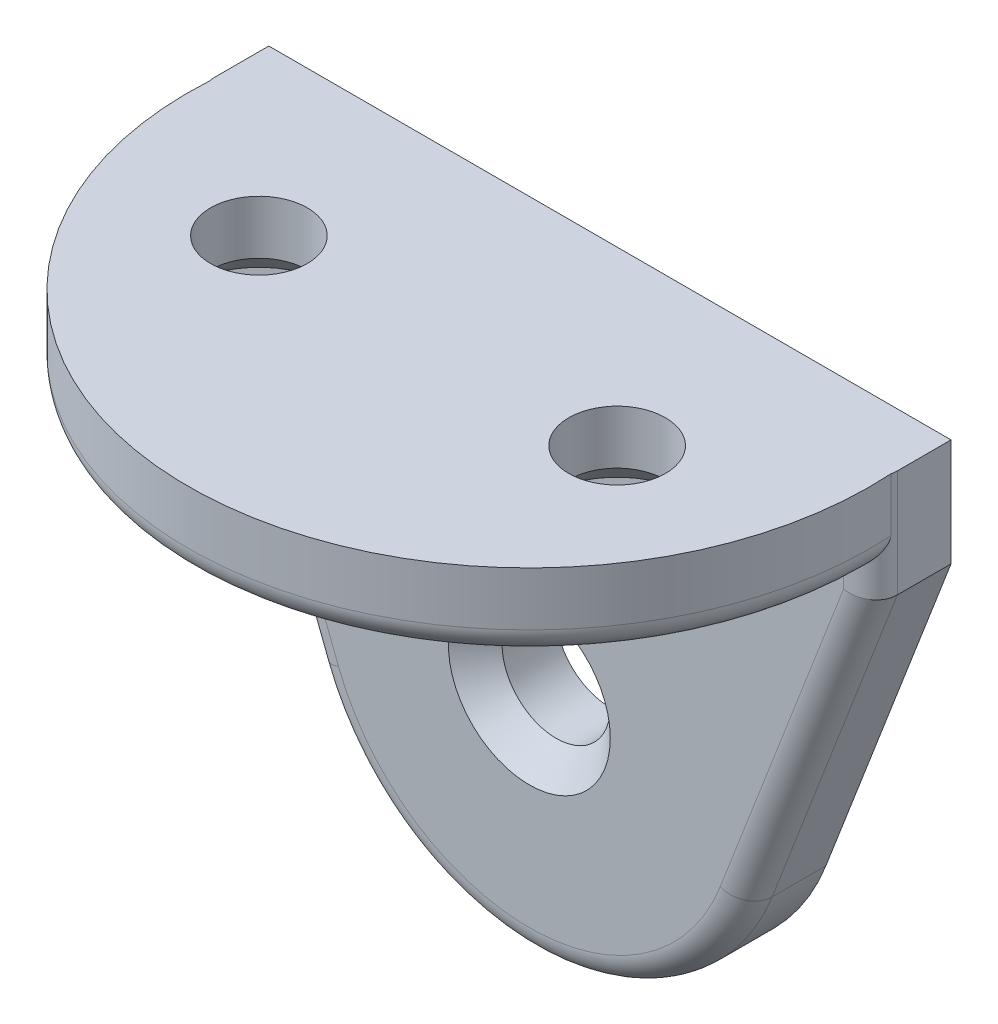
ISO-10303-21;
HEADER;
FILE_DESCRIPTION(('STEP AP214'),'2;1');
FILE_NAME('part.step','',(''),(''),'','','');
FILE_SCHEMA(('AUTOMOTIVE_DESIGN { 1 0 10303 214 1 1 1 1 }'));
ENDSEC;
DATA;
#1=APPLICATION_CONTEXT('core data for automotive mechanical design processes');
#2=APPLICATION_PROTOCOL_DEFINITION('international standard','automotive_design',2000,#1);
#3=PRODUCT_CONTEXT('',#1,'mechanical');
#4=PRODUCT('Part','Part','',(#3));
#5=PRODUCT_RELATED_PRODUCT_CATEGORY('part','',(#4));
#6=PRODUCT_DEFINITION_FORMATION('','',#4);
#7=PRODUCT_DEFINITION_CONTEXT('part definition',#1,'design');
#8=PRODUCT_DEFINITION('design','',#6,#7);
#9=PRODUCT_DEFINITION_SHAPE('','',#8);
#10=(LENGTH_UNIT() NAMED_UNIT(*) SI_UNIT(.MILLI.,.METRE.));
#11=(NAMED_UNIT(*) PLANE_ANGLE_UNIT() SI_UNIT($,.RADIAN.));
#12=(NAMED_UNIT(*) SI_UNIT($,.STERADIAN.) SOLID_ANGLE_UNIT());
#13=UNCERTAINTY_MEASURE_WITH_UNIT(LENGTH_MEASURE(1.E-05),#10,'distance_accuracy_value','');
#14=(GEOMETRIC_REPRESENTATION_CONTEXT(3) GLOBAL_UNCERTAINTY_ASSIGNED_CONTEXT((#13)) GLOBAL_UNIT_ASSIGNED_CONTEXT((#10,
#11,#12)) REPRESENTATION_CONTEXT('',''));
#15=CARTESIAN_POINT('',(0.,0.,0.));
#16=DIRECTION('',(0.,0.,1.));
#17=DIRECTION('',(1.,0.,0.));
#18=AXIS2_PLACEMENT_3D('',#15,#16,#17);
#19=CARTESIAN_POINT('',(9.80421891414499E-06,336.28568414226,3.));
#20=DIRECTION('',(0.,0.,1.));
#21=DIRECTION('',(1.,0.,0.));
#22=AXIS2_PLACEMENT_3D('',#19,#20,#21);
#23=PLANE('',#22);
#24=DIRECTION('',(1.,0.,0.));
#25=VECTOR('',#24,1.);
#26=CARTESIAN_POINT('',(-12.7,346.247211517188,3.00000000000001));
#27=LINE('',#26,#25);
#28=CARTESIAN_POINT('',(-11.7000000000015,346.247211517188,3.00000000000001));
#29=VERTEX_POINT('',#28);
#30=CARTESIAN_POINT('',(11.6999999999991,346.247211517188,3.00000000000001));
#31=VERTEX_POINT('',#30);
#32=EDGE_CURVE('E170',#29,#31,#27,.T.);
#33=ORIENTED_EDGE('',*,*,#32,.F.);
#34=DIRECTION('',(0.,-1.,0.));
#35=VECTOR('',#34,1.);
#36=CARTESIAN_POINT('',(-11.7,345.247211517184,3.));
#37=LINE('',#36,#35);
#38=CARTESIAN_POINT('',(-11.7,345.433623759028,3.));
#39=VERTEX_POINT('',#38);
#40=EDGE_CURVE('E241',#29,#39,#37,.T.);
#41=ORIENTED_EDGE('',*,*,#40,.T.);
#42=DIRECTION('',(0.3603040881604,-0.932834907180742,0.));
#43=VECTOR('',#42,1.);
#44=CARTESIAN_POINT('',(-7.10645479987016,333.540838050512,3.));
#45=LINE('',#44,#43);
#46=CARTESIAN_POINT('',(-7.10645479987004,333.540838050512,3.));
#47=VERTEX_POINT('',#46);
#48=EDGE_CURVE('E235',#39,#47,#45,.T.);
#49=ORIENTED_EDGE('',*,*,#48,.T.);
#50=CARTESIAN_POINT('',(9.80421891414499E-06,336.28568414226,3.));
#51=DIRECTION('',(0.,0.,1.));
#52=DIRECTION('',(1.,0.,0.));
#53=AXIS2_PLACEMENT_3D('',#50,#51,#52);
#54=CIRCLE('',#53,7.61813751756628);
#55=CARTESIAN_POINT('',(7.10647828965528,333.540848099424,3.));
#56=VERTEX_POINT('',#55);
#57=EDGE_CURVE('E229',#47,#56,#54,.T.);
#58=ORIENTED_EDGE('',*,*,#57,.T.);
#59=DIRECTION('',(0.360302769083212,0.932835416668434,0.));
#60=VECTOR('',#59,1.);
#61=CARTESIAN_POINT('',(11.7671645833316,345.607514286268,3.));
#62=LINE('',#61,#60);
#63=CARTESIAN_POINT('',(11.7,345.433623027433,3.));
#64=VERTEX_POINT('',#63);
#65=EDGE_CURVE('E232',#56,#64,#62,.T.);
#66=ORIENTED_EDGE('',*,*,#65,.T.);
#67=DIRECTION('',(1.6913553890772E-13,1.,0.));
#68=VECTOR('',#67,1.);
#69=CARTESIAN_POINT('',(11.7000000000003,347.247211517188,3.));
#70=LINE('',#69,#68);
#71=EDGE_CURVE('E238',#64,#31,#70,.T.);
#72=ORIENTED_EDGE('',*,*,#71,.T.);
#73=EDGE_LOOP('',(#33,#41,#49,#58,#66,#72));
#74=FACE_BOUND('',#73,.T.);
#75=CARTESIAN_POINT('',(9.80421891414499E-06,336.28568414226,3.));
#76=DIRECTION('',(0.,0.,1.));
#77=DIRECTION('',(1.,0.,0.));
#78=AXIS2_PLACEMENT_3D('',#75,#76,#77);
#79=CIRCLE('',#78,3.013761755858);
#80=CARTESIAN_POINT('',(3.01377156007692,336.28568414226,3.));
#81=VERTEX_POINT('',#80);
#82=EDGE_CURVE('E203',#81,#81,#79,.F.);
#83=ORIENTED_EDGE('',*,*,#82,.T.);
#84=EDGE_LOOP('',(#83));
#85=FACE_BOUND('',#84,.T.);
#86=ADVANCED_FACE('F49',(#74,#85),#23,.T.);
#87=CARTESIAN_POINT('',(9.80421891414499E-06,336.28568414226,0.));
#88=DIRECTION('',(0.,0.,1.));
#89=DIRECTION('',(1.,0.,0.));
#90=AXIS2_PLACEMENT_3D('',#87,#88,#89);
#91=PLANE('',#90);
#92=DIRECTION('',(1.6913553890772E-13,1.,0.));
#93=VECTOR('',#92,1.);
#94=CARTESIAN_POINT('',(12.7000000000007,349.247211517185,0.));
#95=LINE('',#94,#93);
#96=CARTESIAN_POINT('',(12.7,345.247211517184,0.));
#97=VERTEX_POINT('',#96);
#98=CARTESIAN_POINT('',(12.7000000000007,349.247211517185,0.));
#99=VERTEX_POINT('',#98);
#100=EDGE_CURVE('E155',#97,#99,#95,.T.);
#101=ORIENTED_EDGE('',*,*,#100,.F.);
#102=DIRECTION('',(0.360302769083212,0.932835416668434,0.));
#103=VECTOR('',#102,1.);
#104=CARTESIAN_POINT('',(12.7,345.247211517184,0.));
#105=LINE('',#104,#103);
#106=CARTESIAN_POINT('',(8.03931370632371,333.180545330341,0.));
#107=VERTEX_POINT('',#106);
#108=EDGE_CURVE('E184',#107,#97,#105,.T.);
#109=ORIENTED_EDGE('',*,*,#108,.F.);
#110=CARTESIAN_POINT('',(9.80421891414499E-06,336.28568414226,0.));
#111=DIRECTION('',(0.,0.,1.));
#112=DIRECTION('',(1.,0.,0.));
#113=AXIS2_PLACEMENT_3D('',#110,#111,#112);
#114=CIRCLE('',#113,8.61813751756628);
#115=CARTESIAN_POINT('',(-8.03928970705091,333.180533962352,0.));
#116=VERTEX_POINT('',#115);
#117=EDGE_CURVE('E180',#116,#107,#114,.T.);
#118=ORIENTED_EDGE('',*,*,#117,.F.);
#119=DIRECTION('',(0.3603040881604,-0.932834907180742,0.));
#120=VECTOR('',#119,1.);
#121=CARTESIAN_POINT('',(-12.7,345.247211517184,0.));
#122=LINE('',#121,#120);
#123=CARTESIAN_POINT('',(-12.7,345.247211517184,0.));
#124=VERTEX_POINT('',#123);
#125=EDGE_CURVE('E176',#124,#116,#122,.T.);
#126=ORIENTED_EDGE('',*,*,#125,.F.);
#127=DIRECTION('',(0.,-1.,0.));
#128=VECTOR('',#127,1.);
#129=CARTESIAN_POINT('',(-12.7,349.247211517185,0.));
#130=LINE('',#129,#128);
#131=CARTESIAN_POINT('',(-12.7,349.247211517185,0.));
#132=VERTEX_POINT('',#131);
#133=EDGE_CURVE('E158',#132,#124,#130,.T.);
#134=ORIENTED_EDGE('',*,*,#133,.F.);
#135=DIRECTION('',(-1.,0.,0.));
#136=VECTOR('',#135,1.);
#137=CARTESIAN_POINT('',(12.7000000000007,349.247211517185,0.));
#138=LINE('',#137,#136);
#139=EDGE_CURVE('E139',#99,#132,#138,.T.);
#140=ORIENTED_EDGE('',*,*,#139,.F.);
#141=EDGE_LOOP('',(#101,#109,#118,#126,#134,#140));
#142=FACE_BOUND('',#141,.T.);
#143=CARTESIAN_POINT('',(9.80421891414499E-06,336.28568414226,0.));
#144=DIRECTION('',(0.,0.,1.));
#145=DIRECTION('',(1.,0.,0.));
#146=AXIS2_PLACEMENT_3D('',#143,#144,#145);
#147=CIRCLE('',#146,2.01376175585801);
#148=CARTESIAN_POINT('',(2.01377156007693,336.28568414226,0.));
#149=VERTEX_POINT('',#148);
#150=EDGE_CURVE('E166',#149,#149,#147,.T.);
#151=ORIENTED_EDGE('',*,*,#150,.T.);
#152=EDGE_LOOP('',(#151));
#153=FACE_BOUND('',#152,.T.);
#154=ADVANCED_FACE('F152',(#142,#153),#91,.F.);
#155=CARTESIAN_POINT('',(12.7000000000007,349.247211517185,3.));
#156=DIRECTION('',(-1.,1.6913553890772E-13,0.));
#157=DIRECTION('',(-1.6913553890772E-13,-1.,0.));
#158=AXIS2_PLACEMENT_3D('',#155,#156,#157);
#159=PLANE('',#158);
#160=DIRECTION('',(0.,0.,-1.));
#161=VECTOR('',#160,1.);
#162=CARTESIAN_POINT('',(12.7000000000007,349.247211517185,3.));
#163=LINE('',#162,#161);
#164=CARTESIAN_POINT('',(12.7000000000007,349.247211517185,2.));
#165=VERTEX_POINT('',#164);
#166=EDGE_CURVE('E133',#165,#99,#163,.T.);
#167=ORIENTED_EDGE('',*,*,#166,.F.);
#168=DIRECTION('',(1.6913553890772E-13,1.,0.));
#169=VECTOR('',#168,1.);
#170=CARTESIAN_POINT('',(12.7,345.247211517184,2.));
#171=LINE('',#170,#169);
#172=CARTESIAN_POINT('',(12.7,345.247211517184,2.));
#173=VERTEX_POINT('',#172);
#174=EDGE_CURVE('E253',#165,#173,#171,.F.);
#175=ORIENTED_EDGE('',*,*,#174,.T.);
#176=DIRECTION('',(0.,0.,-1.));
#177=VECTOR('',#176,1.);
#178=CARTESIAN_POINT('',(12.7,345.247211517184,3.));
#179=LINE('',#178,#177);
#180=EDGE_CURVE('E163',#173,#97,#179,.T.);
#181=ORIENTED_EDGE('',*,*,#180,.T.);
#182=ORIENTED_EDGE('',*,*,#100,.T.);
#183=EDGE_LOOP('',(#167,#175,#181,#182));
#184=FACE_BOUND('',#183,.T.);
#185=ADVANCED_FACE('F161',(#184),#159,.F.);
#186=CARTESIAN_POINT('',(12.7000000000007,349.247211517185,3.));
#187=DIRECTION('',(0.,-1.,0.));
#188=DIRECTION('',(1.,0.,0.));
#189=AXIS2_PLACEMENT_3D('',#186,#187,#188);
#190=PLANE('',#189);
#191=CARTESIAN_POINT('',(-11.7,349.247211517185,2.));
#192=DIRECTION('',(0.,-1.,0.));
#193=DIRECTION('',(1.,0.,0.));
#194=AXIS2_PLACEMENT_3D('',#191,#192,#193);
#195=CIRCLE('',#194,1.);
#196=CARTESIAN_POINT('',(-12.7,349.247211517185,2.));
#197=VERTEX_POINT('',#196);
#198=CARTESIAN_POINT('',(-12.675911637922,349.247211517185,2.21816616366818));
#199=VERTEX_POINT('',#198);
#200=EDGE_CURVE('E250',#197,#199,#195,.F.);
#201=ORIENTED_EDGE('',*,*,#200,.T.);
#202=CARTESIAN_POINT('',(-1.21939012165526E-12,349.247211517188,3.));
#203=DIRECTION('',(0.,-1.,0.));
#204=DIRECTION('',(0.,0.,-1.));
#205=AXIS2_PLACEMENT_3D('',#202,#203,#204);
#206=CIRCLE('',#205,12.7000000000003);
#207=CARTESIAN_POINT('',(12.6759116379203,349.247211517185,2.21816616367908));
#208=VERTEX_POINT('',#207);
#209=EDGE_CURVE('E367',#208,#199,#206,.T.);
#210=ORIENTED_EDGE('',*,*,#209,.F.);
#211=CARTESIAN_POINT('',(11.7000000000007,349.247211517185,2.));
#212=DIRECTION('',(0.,-1.,0.));
#213=DIRECTION('',(1.,0.,0.));
#214=AXIS2_PLACEMENT_3D('',#211,#212,#213);
#215=CIRCLE('',#214,1.);
#216=EDGE_CURVE('E142',#208,#165,#215,.F.);
#217=ORIENTED_EDGE('',*,*,#216,.T.);
#218=ORIENTED_EDGE('',*,*,#166,.T.);
#219=ORIENTED_EDGE('',*,*,#139,.T.);
#220=DIRECTION('',(0.,0.,-1.));
#221=VECTOR('',#220,1.);
#222=CARTESIAN_POINT('',(-12.7,349.247211517185,3.));
#223=LINE('',#222,#221);
#224=EDGE_CURVE('E148',#197,#132,#223,.T.);
#225=ORIENTED_EDGE('',*,*,#224,.F.);
#226=EDGE_LOOP('',(#201,#210,#217,#218,#219,#225));
#227=FACE_BOUND('',#226,.T.);
#228=CARTESIAN_POINT('',(-6.76844476050707,349.247211517188,6.2999999999915));
#229=DIRECTION('',(0.,-1.,0.));
#230=DIRECTION('',(0.,0.,-1.));
#231=AXIS2_PLACEMENT_3D('',#228,#229,#230);
#232=CIRCLE('',#231,1.8);
#233=CARTESIAN_POINT('',(-6.76844476050707,349.247211517188,4.4999999999915));
#234=VERTEX_POINT('',#233);
#235=EDGE_CURVE('E362',#234,#234,#232,.T.);
#236=ORIENTED_EDGE('',*,*,#235,.T.);
#237=EDGE_LOOP('',(#236));
#238=FACE_BOUND('',#237,.T.);
#239=CARTESIAN_POINT('',(6.66844476050722,349.247211517188,6.40000000000055));
#240=DIRECTION('',(0.,-1.,0.));
#241=DIRECTION('',(0.,0.,-1.));
#242=AXIS2_PLACEMENT_3D('',#239,#240,#241);
#243=CIRCLE('',#242,1.8);
#244=CARTESIAN_POINT('',(6.66844476050722,349.247211517188,4.60000000000055));
#245=VERTEX_POINT('',#244);
#246=EDGE_CURVE('E359',#245,#245,#243,.T.);
#247=ORIENTED_EDGE('',*,*,#246,.T.);
#248=EDGE_LOOP('',(#247));
#249=FACE_BOUND('',#248,.T.);
#250=ADVANCED_FACE('F136',(#227,#238,#249),#190,.F.);
#251=CARTESIAN_POINT('',(-12.7,349.247211517185,3.));
#252=DIRECTION('',(1.,0.,0.));
#253=DIRECTION('',(0.,0.,-1.));
#254=AXIS2_PLACEMENT_3D('',#251,#252,#253);
#255=PLANE('',#254);
#256=DIRECTION('',(0.,0.,-1.));
#257=VECTOR('',#256,1.);
#258=CARTESIAN_POINT('',(-12.7,345.247211517184,3.));
#259=LINE('',#258,#257);
#260=CARTESIAN_POINT('',(-12.7,345.247211517184,2.));
#261=VERTEX_POINT('',#260);
#262=EDGE_CURVE('E195',#261,#124,#259,.T.);
#263=ORIENTED_EDGE('',*,*,#262,.F.);
#264=DIRECTION('',(0.,-1.,0.));
#265=VECTOR('',#264,1.);
#266=CARTESIAN_POINT('',(-12.7,347.247211517188,2.));
#267=LINE('',#266,#265);
#268=EDGE_CURVE('E245',#261,#197,#267,.F.);
#269=ORIENTED_EDGE('',*,*,#268,.T.);
#270=ORIENTED_EDGE('',*,*,#224,.T.);
#271=ORIENTED_EDGE('',*,*,#133,.T.);
#272=EDGE_LOOP('',(#263,#269,#270,#271));
#273=FACE_BOUND('',#272,.T.);
#274=ADVANCED_FACE('F315',(#273),#255,.F.);
#275=CARTESIAN_POINT('',(-12.7,345.247211517184,3.));
#276=DIRECTION('',(0.932834907180742,0.360304088160399,0.));
#277=DIRECTION('',(-0.3603040881604,0.932834907180742,0.));
#278=AXIS2_PLACEMENT_3D('',#275,#276,#277);
#279=PLANE('',#278);
#280=DIRECTION('',(0.,0.,-1.));
#281=VECTOR('',#280,1.);
#282=CARTESIAN_POINT('',(-8.03928970705091,333.180533962352,3.));
#283=LINE('',#282,#281);
#284=CARTESIAN_POINT('',(-8.03928970705091,333.180533962352,2.));
#285=VERTEX_POINT('',#284);
#286=EDGE_CURVE('E192',#285,#116,#283,.T.);
#287=ORIENTED_EDGE('',*,*,#286,.F.);
#288=DIRECTION('',(0.3603040881604,-0.932834907180742,0.));
#289=VECTOR('',#288,1.);
#290=CARTESIAN_POINT('',(-12.7,345.247211517184,2.));
#291=LINE('',#290,#289);
#292=EDGE_CURVE('E256',#285,#261,#291,.F.);
#293=ORIENTED_EDGE('',*,*,#292,.T.);
#294=ORIENTED_EDGE('',*,*,#262,.T.);
#295=ORIENTED_EDGE('',*,*,#125,.T.);
#296=EDGE_LOOP('',(#287,#293,#294,#295));
#297=FACE_BOUND('',#296,.T.);
#298=ADVANCED_FACE('F318',(#297),#279,.F.);
#299=CARTESIAN_POINT('',(9.80421891414499E-06,336.28568414226,3.));
#300=DIRECTION('',(0.,0.,-1.));
#301=DIRECTION('',(-1.,0.,0.));
#302=AXIS2_PLACEMENT_3D('',#299,#300,#301);
#303=CYLINDRICAL_SURFACE('',#302,8.61813751756628);
#304=DIRECTION('',(0.,0.,-1.));
#305=VECTOR('',#304,1.);
#306=CARTESIAN_POINT('',(8.03931370632371,333.180545330341,3.));
#307=LINE('',#306,#305);
#308=CARTESIAN_POINT('',(8.03931370632371,333.180545330341,2.));
#309=VERTEX_POINT('',#308);
#310=EDGE_CURVE('E189',#309,#107,#307,.T.);
#311=ORIENTED_EDGE('',*,*,#310,.F.);
#312=CARTESIAN_POINT('',(9.80421891414499E-06,336.28568414226,2.));
#313=DIRECTION('',(0.,0.,1.));
#314=DIRECTION('',(1.,0.,0.));
#315=AXIS2_PLACEMENT_3D('',#312,#313,#314);
#316=CIRCLE('',#315,8.61813751756628);
#317=EDGE_CURVE('E262',#309,#285,#316,.F.);
#318=ORIENTED_EDGE('',*,*,#317,.T.);
#319=ORIENTED_EDGE('',*,*,#286,.T.);
#320=ORIENTED_EDGE('',*,*,#117,.T.);
#321=EDGE_LOOP('',(#311,#318,#319,#320));
#322=FACE_BOUND('',#321,.T.);
#323=ADVANCED_FACE('F322',(#322),#303,.T.);
#324=CARTESIAN_POINT('',(12.7,345.247211517184,3.));
#325=DIRECTION('',(-0.932835416668433,0.360302769083212,0.));
#326=DIRECTION('',(-0.360302769083212,-0.932835416668434,0.));
#327=AXIS2_PLACEMENT_3D('',#324,#325,#326);
#328=PLANE('',#327);
#329=ORIENTED_EDGE('',*,*,#180,.F.);
#330=DIRECTION('',(0.360302769083212,0.932835416668434,0.));
#331=VECTOR('',#330,1.);
#332=CARTESIAN_POINT('',(8.03931370632359,333.180545330341,2.));
#333=LINE('',#332,#331);
#334=EDGE_CURVE('E259',#173,#309,#333,.F.);
#335=ORIENTED_EDGE('',*,*,#334,.T.);
#336=ORIENTED_EDGE('',*,*,#310,.T.);
#337=ORIENTED_EDGE('',*,*,#108,.T.);
#338=EDGE_LOOP('',(#329,#335,#336,#337));
#339=FACE_BOUND('',#338,.T.);
#340=ADVANCED_FACE('F326',(#339),#328,.F.);
#341=CARTESIAN_POINT('',(9.80421891414499E-06,336.28568414226,3.));
#342=DIRECTION('',(0.,0.,-1.));
#343=DIRECTION('',(-1.,0.,0.));
#344=AXIS2_PLACEMENT_3D('',#341,#342,#343);
#345=CYLINDRICAL_SURFACE('',#344,2.01376175585801);
#346=CARTESIAN_POINT('',(9.80421891414499E-06,336.28568414226,2.00000000000001));
#347=DIRECTION('',(0.,0.,1.));
#348=DIRECTION('',(1.,0.,0.));
#349=AXIS2_PLACEMENT_3D('',#346,#347,#348);
#350=CIRCLE('',#349,2.01376175585801);
#351=CARTESIAN_POINT('',(2.01377156007693,336.28568414226,2.00000000000001));
#352=VERTEX_POINT('',#351);
#353=EDGE_CURVE('E147',#352,#352,#350,.T.);
#354=ORIENTED_EDGE('',*,*,#353,.T.);
#355=EDGE_LOOP('',(#354));
#356=FACE_BOUND('',#355,.T.);
#357=ORIENTED_EDGE('',*,*,#150,.F.);
#358=EDGE_LOOP('',(#357));
#359=FACE_BOUND('',#358,.T.);
#360=ADVANCED_FACE('F330',(#356,#359),#345,.F.);
#361=CARTESIAN_POINT('',(-1.20891567763873E-12,346.247211517188,3.00000000000001));
#362=DIRECTION('',(0.,-1.,0.));
#363=DIRECTION('',(0.,0.,-1.));
#364=AXIS2_PLACEMENT_3D('',#361,#362,#363);
#365=PLANE('',#364);
#366=CARTESIAN_POINT('',(6.66844476050723,346.247211517188,6.40000000000056));
#367=DIRECTION('',(0.,-1.,0.));
#368=DIRECTION('',(0.,0.,-1.));
#369=AXIS2_PLACEMENT_3D('',#366,#367,#368);
#370=CIRCLE('',#369,2.80000000000006);
#371=CARTESIAN_POINT('',(6.66844476050723,346.247211517188,3.6000000000005));
#372=VERTEX_POINT('',#371);
#373=EDGE_CURVE('E215',#372,#372,#370,.F.);
#374=ORIENTED_EDGE('',*,*,#373,.T.);
#375=EDGE_LOOP('',(#374));
#376=FACE_BOUND('',#375,.T.);
#377=CARTESIAN_POINT('',(-6.76844476050706,346.247211517188,6.29999999999151));
#378=DIRECTION('',(0.,-1.,0.));
#379=DIRECTION('',(0.,0.,-1.));
#380=AXIS2_PLACEMENT_3D('',#377,#378,#379);
#381=CIRCLE('',#380,2.80000000000003);
#382=CARTESIAN_POINT('',(-6.76844476050706,346.247211517188,3.49999999999148));
#383=VERTEX_POINT('',#382);
#384=EDGE_CURVE('E211',#383,#383,#381,.F.);
#385=ORIENTED_EDGE('',*,*,#384,.T.);
#386=EDGE_LOOP('',(#385));
#387=FACE_BOUND('',#386,.T.);
#388=ORIENTED_EDGE('',*,*,#32,.T.);
#389=CARTESIAN_POINT('',(-1.20891567763873E-12,346.247211517188,3.00000000000001));
#390=DIRECTION('',(0.,-1.,0.));
#391=DIRECTION('',(0.,0.,-1.));
#392=AXIS2_PLACEMENT_3D('',#389,#390,#391);
#393=CIRCLE('',#392,11.7000000000003);
#394=EDGE_CURVE('E223',#31,#29,#393,.T.);
#395=ORIENTED_EDGE('',*,*,#394,.T.);
#396=EDGE_LOOP('',(#388,#395));
#397=FACE_BOUND('',#396,.T.);
#398=ADVANCED_FACE('F339',(#376,#387,#397),#365,.T.);
#399=CARTESIAN_POINT('',(-1.20891567763873E-12,346.247211517188,3.00000000000001));
#400=DIRECTION('',(0.,1.,0.));
#401=DIRECTION('',(0.,0.,1.));
#402=AXIS2_PLACEMENT_3D('',#399,#400,#401);
#403=CYLINDRICAL_SURFACE('',#402,12.7000000000003);
#404=ORIENTED_EDGE('',*,*,#209,.T.);
#405=DIRECTION('',(0.,1.,0.));
#406=VECTOR('',#405,1.);
#407=CARTESIAN_POINT('',(-12.675911637922,349.247211517185,2.21816616366818));
#408=LINE('',#407,#406);
#409=CARTESIAN_POINT('',(-12.6759116379218,347.247211517188,2.21816616366594));
#410=VERTEX_POINT('',#409);
#411=EDGE_CURVE('E265',#199,#410,#408,.F.);
#412=ORIENTED_EDGE('',*,*,#411,.T.);
#413=CARTESIAN_POINT('',(-1.21240715897758E-12,347.247211517188,3.00000000000001));
#414=DIRECTION('',(0.,-1.,0.));
#415=DIRECTION('',(0.,0.,-1.));
#416=AXIS2_PLACEMENT_3D('',#413,#414,#415);
#417=CIRCLE('',#416,12.7000000000003);
#418=CARTESIAN_POINT('',(12.67591163792,347.247211517188,2.21816616367562));
#419=VERTEX_POINT('',#418);
#420=EDGE_CURVE('E67',#410,#419,#417,.F.);
#421=ORIENTED_EDGE('',*,*,#420,.T.);
#422=DIRECTION('',(-1.6913553890772E-13,-1.,0.));
#423=VECTOR('',#422,1.);
#424=CARTESIAN_POINT('',(12.67591163792,347.247211517188,2.21816616367562));
#425=LINE('',#424,#423);
#426=EDGE_CURVE('E11',#419,#208,#425,.F.);
#427=ORIENTED_EDGE('',*,*,#426,.T.);
#428=EDGE_LOOP('',(#404,#412,#421,#427));
#429=FACE_BOUND('',#428,.T.);
#430=ADVANCED_FACE('F341',(#429),#403,.T.);
#431=CARTESIAN_POINT('',(-6.76844476050706,346.247211517188,6.29999999999151));
#432=DIRECTION('',(0.,1.,0.));
#433=DIRECTION('',(0.,0.,1.));
#434=AXIS2_PLACEMENT_3D('',#431,#432,#433);
#435=CYLINDRICAL_SURFACE('',#434,1.8);
#436=CARTESIAN_POINT('',(-6.76844476050707,347.247211517188,6.29999999999151));
#437=DIRECTION('',(0.,-1.,0.));
#438=DIRECTION('',(0.,0.,-1.));
#439=AXIS2_PLACEMENT_3D('',#436,#437,#438);
#440=CIRCLE('',#439,1.8);
#441=CARTESIAN_POINT('',(-6.76844476050707,347.247211517188,4.4999999999915));
#442=VERTEX_POINT('',#441);
#443=EDGE_CURVE('E219',#442,#442,#440,.T.);
#444=ORIENTED_EDGE('',*,*,#443,.T.);
#445=EDGE_LOOP('',(#444));
#446=FACE_BOUND('',#445,.T.);
#447=ORIENTED_EDGE('',*,*,#235,.F.);
#448=EDGE_LOOP('',(#447));
#449=FACE_BOUND('',#448,.T.);
#450=ADVANCED_FACE('F344',(#446,#449),#435,.F.);
#451=CARTESIAN_POINT('',(6.66844476050723,346.247211517188,6.40000000000056));
#452=DIRECTION('',(0.,1.,0.));
#453=DIRECTION('',(0.,0.,1.));
#454=AXIS2_PLACEMENT_3D('',#451,#452,#453);
#455=CYLINDRICAL_SURFACE('',#454,1.8);
#456=CARTESIAN_POINT('',(6.66844476050723,347.247211517188,6.40000000000055));
#457=DIRECTION('',(0.,-1.,0.));
#458=DIRECTION('',(0.,0.,-1.));
#459=AXIS2_PLACEMENT_3D('',#456,#457,#458);
#460=CIRCLE('',#459,1.8);
#461=CARTESIAN_POINT('',(6.66844476050723,347.247211517188,4.60000000000055));
#462=VERTEX_POINT('',#461);
#463=EDGE_CURVE('E207',#462,#462,#460,.T.);
#464=ORIENTED_EDGE('',*,*,#463,.T.);
#465=EDGE_LOOP('',(#464));
#466=FACE_BOUND('',#465,.T.);
#467=ORIENTED_EDGE('',*,*,#246,.F.);
#468=EDGE_LOOP('',(#467));
#469=FACE_BOUND('',#468,.T.);
#470=ADVANCED_FACE('F309',(#466,#469),#455,.F.);
#471=CARTESIAN_POINT('',(9.80421891414499E-06,336.28568414226,2.00000000000001));
#472=DIRECTION('',(0.,0.,1.));
#473=DIRECTION('',(1.,0.,0.));
#474=AXIS2_PLACEMENT_3D('',#471,#472,#473);
#475=CONICAL_SURFACE('',#474,2.01376175585801,0.78539816339745);
#476=ORIENTED_EDGE('',*,*,#82,.F.);
#477=EDGE_LOOP('',(#476));
#478=FACE_BOUND('',#477,.T.);
#479=ORIENTED_EDGE('',*,*,#353,.F.);
#480=EDGE_LOOP('',(#479));
#481=FACE_BOUND('',#480,.T.);
#482=ADVANCED_FACE('F303',(#478,#481),#475,.F.);
#483=CARTESIAN_POINT('',(6.66844476050723,347.247211517188,6.40000000000055));
#484=DIRECTION('',(0.,-1.,0.));
#485=DIRECTION('',(0.,0.,-1.));
#486=AXIS2_PLACEMENT_3D('',#483,#484,#485);
#487=CONICAL_SURFACE('',#486,1.8,0.785398163397467);
#488=ORIENTED_EDGE('',*,*,#373,.F.);
#489=EDGE_LOOP('',(#488));
#490=FACE_BOUND('',#489,.T.);
#491=ORIENTED_EDGE('',*,*,#463,.F.);
#492=EDGE_LOOP('',(#491));
#493=FACE_BOUND('',#492,.T.);
#494=ADVANCED_FACE('F296',(#490,#493),#487,.F.);
#495=CARTESIAN_POINT('',(-6.76844476050707,347.247211517188,6.29999999999151));
#496=DIRECTION('',(0.,-1.,0.));
#497=DIRECTION('',(0.,0.,-1.));
#498=AXIS2_PLACEMENT_3D('',#495,#496,#497);
#499=CONICAL_SURFACE('',#498,1.8,0.785398163397458);
#500=ORIENTED_EDGE('',*,*,#384,.F.);
#501=EDGE_LOOP('',(#500));
#502=FACE_BOUND('',#501,.T.);
#503=ORIENTED_EDGE('',*,*,#443,.F.);
#504=EDGE_LOOP('',(#503));
#505=FACE_BOUND('',#504,.T.);
#506=ADVANCED_FACE('F288',(#502,#505),#499,.F.);
#507=CARTESIAN_POINT('',(-1.21240715897758E-12,347.247211517188,3.00000000000001));
#508=DIRECTION('',(0.,-1.,0.));
#509=DIRECTION('',(0.,0.,-1.));
#510=AXIS2_PLACEMENT_3D('',#507,#508,#509);
#511=TOROIDAL_SURFACE('',#510,11.7000000000003,1.);
#512=ORIENTED_EDGE('',*,*,#394,.F.);
#513=CARTESIAN_POINT('',(11.7000000000002,346.247211517188,3.));
#514=CARTESIAN_POINT('',(11.722370748527,346.247208567629,3.00000298922168));
#515=CARTESIAN_POINT('',(11.7447277280449,346.247962842917,2.99924866587859));
#516=CARTESIAN_POINT('',(11.7892263003128,346.250951182442,2.99626037189852));
#517=CARTESIAN_POINT('',(11.8113680443471,346.25318411749,2.99402753034292));
#518=CARTESIAN_POINT('',(11.8768411768263,346.261997026498,2.98521558271759));
#519=CARTESIAN_POINT('',(11.9196330271447,346.270692526717,2.97652162058349));
#520=CARTESIAN_POINT('',(12.0023299018507,346.293070039176,2.95416599788999));
#521=CARTESIAN_POINT('',(12.0422422350969,346.306738853122,2.94051748604611));
#522=CARTESIAN_POINT('',(12.1186842696196,346.338284771205,2.90907459556414));
#523=CARTESIAN_POINT('',(12.1552067470787,346.356170587307,2.89127163498194));
#524=CARTESIAN_POINT('',(12.2378110382354,346.402936996735,2.84485900321906));
#525=CARTESIAN_POINT('',(12.2821440347796,346.433397108839,2.81473004196818));
#526=CARTESIAN_POINT('',(12.3633590027964,346.499251825623,2.75010932524777));
#527=CARTESIAN_POINT('',(12.4002230356896,346.534657973114,2.71560738231304));
#528=CARTESIAN_POINT('',(12.4776142437126,346.621505840913,2.63207414387772));
#529=CARTESIAN_POINT('',(12.5153849589815,346.674400897567,2.58198591753995));
#530=CARTESIAN_POINT('',(12.5630141090483,346.757870299505,2.50606711735869));
#531=CARTESIAN_POINT('',(12.5773854090644,346.786379387526,2.48063133580732));
#532=CARTESIAN_POINT('',(12.603238473829,346.844935279067,2.43007091820557));
#533=CARTESIAN_POINT('',(12.6147224175323,346.874980902301,2.40494606121188));
#534=CARTESIAN_POINT('',(12.632547946683,346.929877891155,2.36162311027719));
#535=CARTESIAN_POINT('',(12.6394647911577,346.954335594014,2.34316039076963));
#536=CARTESIAN_POINT('',(12.6516272868594,347.004832319509,2.30781637527059));
#537=CARTESIAN_POINT('',(12.6568723965121,347.030871851348,2.29093559301048));
#538=CARTESIAN_POINT('',(12.6642184374461,347.076527374121,2.26533214134242));
#539=CARTESIAN_POINT('',(12.6667889269446,347.095559056666,2.25572066452899));
#540=CARTESIAN_POINT('',(12.6710295263452,347.134759546123,2.23911228665278));
#541=CARTESIAN_POINT('',(12.6727051473613,347.154920527673,2.23209946547359));
#542=CARTESIAN_POINT('',(12.6745479462952,347.187245836431,2.22420005409249));
#543=CARTESIAN_POINT('',(12.6750542990721,347.199059535655,2.2219755327317));
#544=CARTESIAN_POINT('',(12.6757384708292,347.222976929226,2.21894117850323));
#545=CARTESIAN_POINT('',(12.6759134185927,347.235082245938,2.21814371256929));
#546=CARTESIAN_POINT('',(12.67591163792,347.247211517188,2.21816616367562));
#547=B_SPLINE_CURVE_WITH_KNOTS('',3,(#513,#514,#515,#516,#517,#518,#519,#520,#521,#522,#523,
#524,#525,#526,#527,#528,#529,#530,#531,#532,#533,#534,#535,#536,#537,#538,#539,#540,#541,#542,
#543,#544,#545,#546),.UNSPECIFIED.,.F.,.F.,(4,2,2,2,2,2,2,2,2,2,2,2,2,2,2,2,4),(0.,
0.0670607722539798,0.13407039202176,0.266871295833437,0.399322309895921,0.532049391842671,
0.715987881948767,0.900363041804117,1.14514123495762,1.2675155317216,1.38979719916752,
1.48396927729618,1.57817183242604,1.64247593238804,1.7063793054589,1.74238985146769,
1.77871098253618),.UNSPECIFIED.);
#548=EDGE_CURVE('E60',#31,#419,#547,.T.);
#549=ORIENTED_EDGE('',*,*,#548,.T.);
#550=ORIENTED_EDGE('',*,*,#420,.F.);
#551=CARTESIAN_POINT('',(-12.6759116379218,347.247211517188,2.21816616366594));
#552=CARTESIAN_POINT('',(-12.6759183447586,347.228222928222,2.21807664149298));
#553=CARTESIAN_POINT('',(-12.6754885312327,347.209394828687,2.22006751217994));
#554=CARTESIAN_POINT('',(-12.6738494630101,347.172754475598,2.22723679516414));
#555=CARTESIAN_POINT('',(-12.6726558342237,347.154929481377,2.23235121327746));
#556=CARTESIAN_POINT('',(-12.6686061236288,347.109268957188,2.24880599312704));
#557=CARTESIAN_POINT('',(-12.6651763869988,347.082206313103,2.26203870224168));
#558=CARTESIAN_POINT('',(-12.6566554025834,347.029821700876,2.291642366935));
#559=CARTESIAN_POINT('',(-12.6515434022958,347.004526520172,2.30805140777903));
#560=CARTESIAN_POINT('',(-12.6387027475227,346.951122611682,2.34538506617406));
#561=CARTESIAN_POINT('',(-12.6306735369744,346.923290372107,2.36659855234218));
#562=CARTESIAN_POINT('',(-12.6124233615335,346.869074020141,2.40992822238125));
#563=CARTESIAN_POINT('',(-12.602200237532,346.8426913667,2.43204527800089));
#564=CARTESIAN_POINT('',(-12.568243595293,346.765466357391,2.49861770579444));
#565=CARTESIAN_POINT('',(-12.5411750394795,346.716351268689,2.54344562736997));
#566=CARTESIAN_POINT('',(-12.4791378528142,346.6247863636,2.62898382891179));
#567=CARTESIAN_POINT('',(-12.4446024962176,346.582131350177,2.66978859118026));
#568=CARTESIAN_POINT('',(-12.3664839641167,346.501801545504,2.74754518314315));
#569=CARTESIAN_POINT('',(-12.3229121050618,346.464120620858,2.78450174582654));
#570=CARTESIAN_POINT('',(-12.2393363494942,346.404613112789,2.84320230803602));
#571=CARTESIAN_POINT('',(-12.2014507646512,346.381232113854,2.86638146759124));
#572=CARTESIAN_POINT('',(-12.1208850966035,346.339108237725,2.90824428953388));
#573=CARTESIAN_POINT('',(-12.0782102037513,346.32036040864,2.92693275094259));
#574=CARTESIAN_POINT('',(-11.9956670089745,346.291096931431,2.95613446209101));
#575=CARTESIAN_POINT('',(-11.9563808323395,346.279757614383,2.96746400699179));
#576=CARTESIAN_POINT('',(-11.8756994901177,346.261906809929,2.98530495919895));
#577=CARTESIAN_POINT('',(-11.8343089352641,346.255385216001,2.99182645268068));
#578=CARTESIAN_POINT('',(-11.7771451886262,346.250071614471,2.99713994601661));
#579=CARTESIAN_POINT('',(-11.7617508120534,346.249000104486,2.99821142983657));
#580=CARTESIAN_POINT('',(-11.7309066679156,346.247570439261,2.99964106534631));
#581=CARTESIAN_POINT('',(-11.715456945938,346.247211791962,2.99999970907947));
#582=CARTESIAN_POINT('',(-11.7,346.247211517188,3.));
#583=B_SPLINE_CURVE_WITH_KNOTS('',3,(#551,#552,#553,#554,#555,#556,#557,#558,#559,#560,#561,
#562,#563,#564,#565,#566,#567,#568,#569,#570,#571,#572,#573,#574,#575,#576,#577,#578,#579,#580,
#581,#582),.UNSPECIFIED.,.F.,.F.,(4,2,2,2,2,2,2,2,2,2,2,2,2,2,2,4),(0.,0.0566042053136611,
0.112085908237995,0.202542389730784,0.29415942092902,0.401721004707716,0.509388933152525,
0.723975595213374,0.928431995592315,1.13263388392538,1.28268058328836,1.43256621370286,
1.55933668095146,1.68584045057043,1.73222076071409,1.77856904535591),.UNSPECIFIED.);
#584=EDGE_CURVE('E268',#410,#29,#583,.T.);
#585=ORIENTED_EDGE('',*,*,#584,.T.);
#586=EDGE_LOOP('',(#512,#549,#550,#585));
#587=FACE_BOUND('',#586,.T.);
#588=ADVANCED_FACE('F284',(#587),#511,.T.);
#589=CARTESIAN_POINT('',(11.6999999999985,336.285684142258,2.));
#590=DIRECTION('',(-1.6913553890772E-13,-1.,0.));
#591=DIRECTION('',(1.,-1.6913553890772E-13,0.));
#592=AXIS2_PLACEMENT_3D('',#589,#590,#591);
#593=CYLINDRICAL_SURFACE('',#592,1.);
#594=ORIENTED_EDGE('',*,*,#548,.F.);
#595=ORIENTED_EDGE('',*,*,#71,.F.);
#596=CARTESIAN_POINT('',(11.7,345.433623027433,2.));
#597=DIRECTION('',(-0.183254717990598,-0.983065464928041,0.));
#598=DIRECTION('',(-0.983065464928041,0.183254717990598,0.));
#599=AXIS2_PLACEMENT_3D('',#596,#597,#598);
#600=ELLIPSE('',#599,1.01722625366884,1.);
#601=EDGE_CURVE('E54',#173,#64,#600,.T.);
#602=ORIENTED_EDGE('',*,*,#601,.F.);
#603=ORIENTED_EDGE('',*,*,#174,.F.);
#604=ORIENTED_EDGE('',*,*,#216,.F.);
#605=ORIENTED_EDGE('',*,*,#426,.F.);
#606=EDGE_LOOP('',(#594,#595,#602,#603,#604,#605));
#607=FACE_BOUND('',#606,.T.);
#608=ADVANCED_FACE('F51',(#607),#593,.T.);
#609=CARTESIAN_POINT('',(7.10647828965515,333.540848099424,2.));
#610=DIRECTION('',(-0.360302769083212,-0.932835416668434,0.));
#611=DIRECTION('',(0.932835416668434,-0.360302769083212,0.));
#612=AXIS2_PLACEMENT_3D('',#609,#610,#611);
#613=CYLINDRICAL_SURFACE('',#612,1.);
#614=ORIENTED_EDGE('',*,*,#601,.T.);
#615=ORIENTED_EDGE('',*,*,#65,.F.);
#616=CARTESIAN_POINT('',(7.10647828965516,333.540848099424,2.));
#617=DIRECTION('',(-0.36030276908322,-0.932835416668431,0.));
#618=DIRECTION('',(0.932835416668431,-0.36030276908322,0.));
#619=AXIS2_PLACEMENT_3D('',#616,#617,#618);
#620=CIRCLE('',#619,1.);
#621=EDGE_CURVE('E370',#309,#56,#620,.T.);
#622=ORIENTED_EDGE('',*,*,#621,.F.);
#623=ORIENTED_EDGE('',*,*,#334,.F.);
#624=EDGE_LOOP('',(#614,#615,#622,#623));
#625=FACE_BOUND('',#624,.T.);
#626=ADVANCED_FACE('F393',(#625),#613,.T.);
#627=CARTESIAN_POINT('',(9.80421891414499E-06,336.28568414226,2.));
#628=DIRECTION('',(0.,0.,1.));
#629=DIRECTION('',(1.,0.,0.));
#630=AXIS2_PLACEMENT_3D('',#627,#628,#629);
#631=TOROIDAL_SURFACE('',#630,7.61813751756628,1.);
#632=ORIENTED_EDGE('',*,*,#621,.T.);
#633=ORIENTED_EDGE('',*,*,#57,.F.);
#634=CARTESIAN_POINT('',(-7.10645479987005,333.540838050512,2.));
#635=DIRECTION('',(-0.360304088160454,0.932834907180721,0.));
#636=DIRECTION('',(-0.932834907180721,-0.360304088160454,0.));
#637=AXIS2_PLACEMENT_3D('',#634,#635,#636);
#638=CIRCLE('',#637,1.);
#639=EDGE_CURVE('E410',#285,#47,#638,.T.);
#640=ORIENTED_EDGE('',*,*,#639,.F.);
#641=ORIENTED_EDGE('',*,*,#317,.F.);
#642=EDGE_LOOP('',(#632,#633,#640,#641));
#643=FACE_BOUND('',#642,.T.);
#644=ADVANCED_FACE('F417',(#643),#631,.T.);
#645=CARTESIAN_POINT('',(-7.10645479987027,333.540838050513,2.));
#646=DIRECTION('',(-0.3603040881604,0.932834907180742,0.));
#647=DIRECTION('',(-0.932834907180742,-0.360304088160399,0.));
#648=AXIS2_PLACEMENT_3D('',#645,#646,#647);
#649=CYLINDRICAL_SURFACE('',#648,1.);
#650=ORIENTED_EDGE('',*,*,#639,.T.);
#651=ORIENTED_EDGE('',*,*,#48,.F.);
#652=CARTESIAN_POINT('',(-11.7,345.433623759028,2.));
#653=DIRECTION('',(-0.183255413043187,0.983065335361984,0.));
#654=DIRECTION('',(-0.983065335361984,-0.183255413043187,0.));
#655=AXIS2_PLACEMENT_3D('',#652,#653,#654);
#656=ELLIPSE('',#655,1.01722638773727,1.);
#657=EDGE_CURVE('E404',#261,#39,#656,.T.);
#658=ORIENTED_EDGE('',*,*,#657,.F.);
#659=ORIENTED_EDGE('',*,*,#292,.F.);
#660=EDGE_LOOP('',(#650,#651,#658,#659));
#661=FACE_BOUND('',#660,.T.);
#662=ADVANCED_FACE('F408',(#661),#649,.T.);
#663=CARTESIAN_POINT('',(-11.7,336.28568414226,2.));
#664=DIRECTION('',(0.,1.,0.));
#665=DIRECTION('',(0.,0.,1.));
#666=AXIS2_PLACEMENT_3D('',#663,#664,#665);
#667=CYLINDRICAL_SURFACE('',#666,1.);
#668=ORIENTED_EDGE('',*,*,#200,.F.);
#669=ORIENTED_EDGE('',*,*,#268,.F.);
#670=ORIENTED_EDGE('',*,*,#657,.T.);
#671=ORIENTED_EDGE('',*,*,#40,.F.);
#672=ORIENTED_EDGE('',*,*,#584,.F.);
#673=ORIENTED_EDGE('',*,*,#411,.F.);
#674=EDGE_LOOP('',(#668,#669,#670,#671,#672,#673));
#675=FACE_BOUND('',#674,.T.);
#676=ADVANCED_FACE('F281',(#675),#667,.T.);
#677=CLOSED_SHELL('',(#86,#154,#185,#250,#274,#298,#323,#340,#360,#398,#430,#450,#470,#482,#494,
#506,#588,#608,#626,#644,#662,#676));
#678=MANIFOLD_SOLID_BREP('B2',#677);
#679=ADVANCED_BREP_SHAPE_REPRESENTATION('',(#18,#678),#14);
#680=SHAPE_DEFINITION_REPRESENTATION(#9,#679);
ENDSEC;
END-ISO-10303-21;
